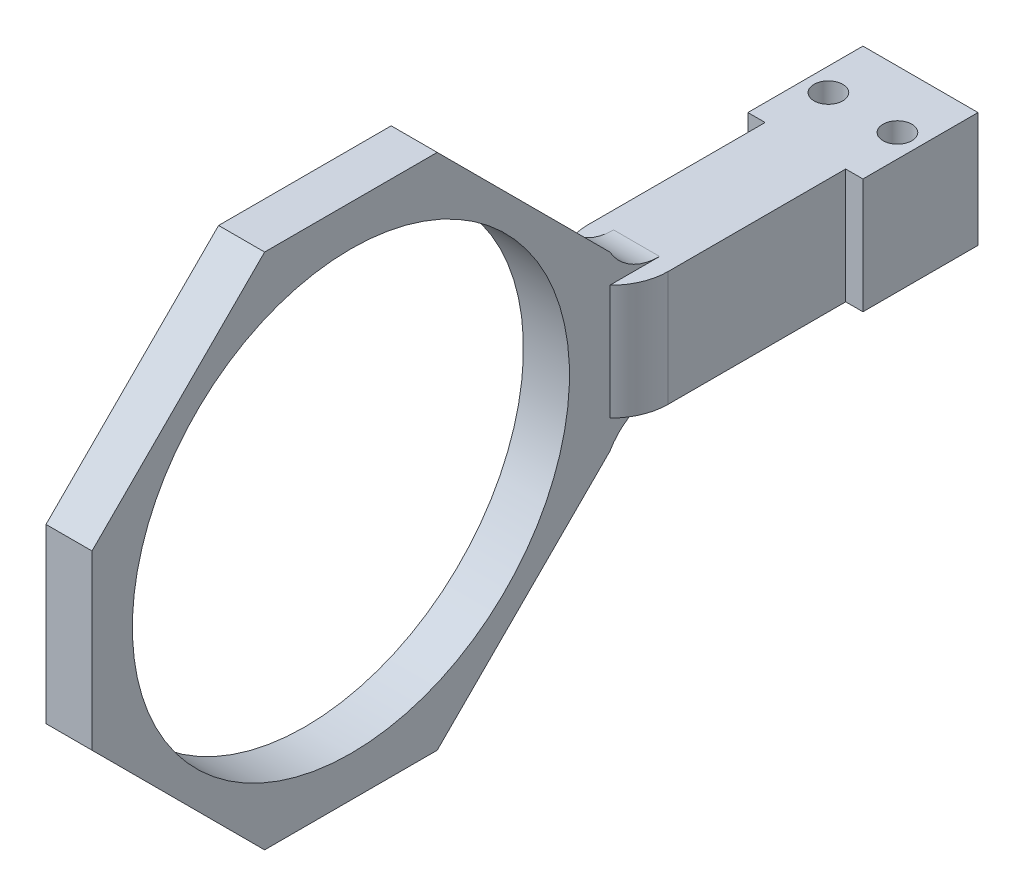
ISO-10303-21;
HEADER;
FILE_DESCRIPTION(('STEP AP214'),'2;1');
FILE_NAME('part.step','',(''),(''),'','','');
FILE_SCHEMA(('AUTOMOTIVE_DESIGN { 1 0 10303 214 1 1 1 1 }'));
ENDSEC;
DATA;
#1=APPLICATION_CONTEXT('core data for automotive mechanical design processes');
#2=APPLICATION_PROTOCOL_DEFINITION('international standard','automotive_design',2000,#1);
#3=PRODUCT_CONTEXT('',#1,'mechanical');
#4=PRODUCT('Part','Part','',(#3));
#5=PRODUCT_RELATED_PRODUCT_CATEGORY('part','',(#4));
#6=PRODUCT_DEFINITION_FORMATION('','',#4);
#7=PRODUCT_DEFINITION_CONTEXT('part definition',#1,'design');
#8=PRODUCT_DEFINITION('design','',#6,#7);
#9=PRODUCT_DEFINITION_SHAPE('','',#8);
#10=(LENGTH_UNIT() NAMED_UNIT(*) SI_UNIT(.MILLI.,.METRE.));
#11=(NAMED_UNIT(*) PLANE_ANGLE_UNIT() SI_UNIT($,.RADIAN.));
#12=(NAMED_UNIT(*) SI_UNIT($,.STERADIAN.) SOLID_ANGLE_UNIT());
#13=UNCERTAINTY_MEASURE_WITH_UNIT(LENGTH_MEASURE(1.E-05),#10,'distance_accuracy_value','');
#14=(GEOMETRIC_REPRESENTATION_CONTEXT(3) GLOBAL_UNCERTAINTY_ASSIGNED_CONTEXT((#13)) GLOBAL_UNIT_ASSIGNED_CONTEXT((#10,
#11,#12)) REPRESENTATION_CONTEXT('',''));
#15=CARTESIAN_POINT('',(0.,0.,0.));
#16=DIRECTION('',(0.,0.,1.));
#17=DIRECTION('',(1.,0.,0.));
#18=AXIS2_PLACEMENT_3D('',#15,#16,#17);
#19=CARTESIAN_POINT('',(0.,0.,20.));
#20=DIRECTION('',(0.,0.,1.));
#21=DIRECTION('',(1.,0.,0.));
#22=AXIS2_PLACEMENT_3D('',#19,#20,#21);
#23=PLANE('',#22);
#24=DIRECTION('',(0.,1.,0.));
#25=VECTOR('',#24,1.);
#26=CARTESIAN_POINT('',(7.,10.,20.));
#27=LINE('',#26,#25);
#28=CARTESIAN_POINT('',(7.,-10.,20.));
#29=VERTEX_POINT('',#28);
#30=CARTESIAN_POINT('',(7.,10.,20.));
#31=VERTEX_POINT('',#30);
#32=EDGE_CURVE('E237',#29,#31,#27,.T.);
#33=ORIENTED_EDGE('',*,*,#32,.F.);
#34=DIRECTION('',(1.,0.,0.));
#35=VECTOR('',#34,1.);
#36=CARTESIAN_POINT('',(-10.,-10.,20.));
#37=LINE('',#36,#35);
#38=CARTESIAN_POINT('',(10.,-10.,20.));
#39=VERTEX_POINT('',#38);
#40=EDGE_CURVE('E271',#29,#39,#37,.T.);
#41=ORIENTED_EDGE('',*,*,#40,.T.);
#42=DIRECTION('',(0.,1.,0.));
#43=VECTOR('',#42,1.);
#44=CARTESIAN_POINT('',(10.,10.,20.));
#45=LINE('',#44,#43);
#46=CARTESIAN_POINT('',(10.,10.,20.));
#47=VERTEX_POINT('',#46);
#48=EDGE_CURVE('E258',#39,#47,#45,.T.);
#49=ORIENTED_EDGE('',*,*,#48,.T.);
#50=DIRECTION('',(-1.,0.,0.));
#51=VECTOR('',#50,1.);
#52=CARTESIAN_POINT('',(-10.,10.,20.));
#53=LINE('',#52,#51);
#54=EDGE_CURVE('E264',#47,#31,#53,.T.);
#55=ORIENTED_EDGE('',*,*,#54,.T.);
#56=EDGE_LOOP('',(#33,#41,#49,#55));
#57=FACE_BOUND('',#56,.T.);
#58=ADVANCED_FACE('F47',(#57),#23,.T.);
#59=CARTESIAN_POINT('',(10.,10.,20.));
#60=DIRECTION('',(-1.,0.,0.));
#61=DIRECTION('',(0.,-1.,0.));
#62=AXIS2_PLACEMENT_3D('',#59,#60,#61);
#63=PLANE('',#62);
#64=DIRECTION('',(0.,1.,0.));
#65=VECTOR('',#64,1.);
#66=CARTESIAN_POINT('',(10.,10.,0.));
#67=LINE('',#66,#65);
#68=CARTESIAN_POINT('',(10.,-10.,0.));
#69=VERTEX_POINT('',#68);
#70=CARTESIAN_POINT('',(10.,10.,0.));
#71=VERTEX_POINT('',#70);
#72=EDGE_CURVE('E257',#69,#71,#67,.T.);
#73=ORIENTED_EDGE('',*,*,#72,.T.);
#74=DIRECTION('',(0.,0.,-1.));
#75=VECTOR('',#74,1.);
#76=CARTESIAN_POINT('',(10.,10.,20.));
#77=LINE('',#76,#75);
#78=EDGE_CURVE('E210',#47,#71,#77,.T.);
#79=ORIENTED_EDGE('',*,*,#78,.F.);
#80=ORIENTED_EDGE('',*,*,#48,.F.);
#81=DIRECTION('',(0.,0.,-1.));
#82=VECTOR('',#81,1.);
#83=CARTESIAN_POINT('',(10.,-10.,20.));
#84=LINE('',#83,#82);
#85=EDGE_CURVE('E276',#39,#69,#84,.T.);
#86=ORIENTED_EDGE('',*,*,#85,.T.);
#87=EDGE_LOOP('',(#73,#79,#80,#86));
#88=FACE_BOUND('',#87,.T.);
#89=ADVANCED_FACE('F455',(#88),#63,.F.);
#90=CARTESIAN_POINT('',(-10.,10.,20.));
#91=DIRECTION('',(0.,-1.,0.));
#92=DIRECTION('',(0.,0.,-1.));
#93=AXIS2_PLACEMENT_3D('',#90,#91,#92);
#94=PLANE('',#93);
#95=CARTESIAN_POINT('',(-6.00000000000001,10.,10.));
#96=DIRECTION('',(0.,1.,0.));
#97=DIRECTION('',(0.,0.,1.));
#98=AXIS2_PLACEMENT_3D('',#95,#96,#97);
#99=CIRCLE('',#98,2.5);
#100=CARTESIAN_POINT('',(-6.00000000000001,9.99999999999999,12.5));
#101=VERTEX_POINT('',#100);
#102=EDGE_CURVE('E391',#101,#101,#99,.T.);
#103=ORIENTED_EDGE('',*,*,#102,.F.);
#104=EDGE_LOOP('',(#103));
#105=FACE_BOUND('',#104,.T.);
#106=CARTESIAN_POINT('',(5.99999999999999,10.,10.));
#107=DIRECTION('',(0.,1.,0.));
#108=DIRECTION('',(0.,0.,1.));
#109=AXIS2_PLACEMENT_3D('',#106,#107,#108);
#110=CIRCLE('',#109,2.5);
#111=CARTESIAN_POINT('',(5.99999999999999,9.99999999999999,12.5));
#112=VERTEX_POINT('',#111);
#113=EDGE_CURVE('E399',#112,#112,#110,.T.);
#114=ORIENTED_EDGE('',*,*,#113,.F.);
#115=EDGE_LOOP('',(#114));
#116=FACE_BOUND('',#115,.T.);
#117=DIRECTION('',(0.,0.,1.));
#118=VECTOR('',#117,1.);
#119=CARTESIAN_POINT('',(4.,10.,148.));
#120=LINE('',#119,#118);
#121=CARTESIAN_POINT('',(4.,10.,49.3397459621557));
#122=VERTEX_POINT('',#121);
#123=CARTESIAN_POINT('',(4.,10.,58.));
#124=VERTEX_POINT('',#123);
#125=EDGE_CURVE('E197',#122,#124,#120,.T.);
#126=ORIENTED_EDGE('',*,*,#125,.T.);
#127=CARTESIAN_POINT('',(-3.,10.,50.8585715714571));
#128=DIRECTION('',(0.,-1.,0.));
#129=DIRECTION('',(0.,0.,-1.));
#130=AXIS2_PLACEMENT_3D('',#127,#128,#129);
#131=CIRCLE('',#130,10.);
#132=CARTESIAN_POINT('',(7.,10.,50.8585715714571));
#133=VERTEX_POINT('',#132);
#134=EDGE_CURVE('E188',#124,#133,#131,.F.);
#135=ORIENTED_EDGE('',*,*,#134,.T.);
#136=DIRECTION('',(0.,0.,-1.));
#137=VECTOR('',#136,1.);
#138=CARTESIAN_POINT('',(7.,10.,58.));
#139=LINE('',#138,#137);
#140=EDGE_CURVE('E254',#133,#31,#139,.T.);
#141=ORIENTED_EDGE('',*,*,#140,.T.);
#142=ORIENTED_EDGE('',*,*,#54,.F.);
#143=ORIENTED_EDGE('',*,*,#78,.T.);
#144=DIRECTION('',(-1.,0.,0.));
#145=VECTOR('',#144,1.);
#146=CARTESIAN_POINT('',(-10.,10.,0.));
#147=LINE('',#146,#145);
#148=CARTESIAN_POINT('',(-10.,10.,0.));
#149=VERTEX_POINT('',#148);
#150=EDGE_CURVE('E280',#71,#149,#147,.T.);
#151=ORIENTED_EDGE('',*,*,#150,.T.);
#152=DIRECTION('',(0.,0.,-1.));
#153=VECTOR('',#152,1.);
#154=CARTESIAN_POINT('',(-10.,10.,20.));
#155=LINE('',#154,#153);
#156=CARTESIAN_POINT('',(-10.,10.,20.));
#157=VERTEX_POINT('',#156);
#158=EDGE_CURVE('E217',#157,#149,#155,.T.);
#159=ORIENTED_EDGE('',*,*,#158,.F.);
#160=CARTESIAN_POINT('',(-7.,10.,20.));
#161=VERTEX_POINT('',#160);
#162=EDGE_CURVE('E262',#161,#157,#53,.T.);
#163=ORIENTED_EDGE('',*,*,#162,.F.);
#164=DIRECTION('',(0.,0.,-1.));
#165=VECTOR('',#164,1.);
#166=CARTESIAN_POINT('',(-7.,10.,58.));
#167=LINE('',#166,#165);
#168=CARTESIAN_POINT('',(-7.,10.,50.8585715714571));
#169=VERTEX_POINT('',#168);
#170=EDGE_CURVE('E251',#169,#161,#167,.T.);
#171=ORIENTED_EDGE('',*,*,#170,.F.);
#172=CARTESIAN_POINT('',(3.,10.,50.8585715714571));
#173=DIRECTION('',(0.,-1.,0.));
#174=DIRECTION('',(0.,0.,-1.));
#175=AXIS2_PLACEMENT_3D('',#172,#173,#174);
#176=CIRCLE('',#175,10.);
#177=CARTESIAN_POINT('',(-4.,10.,58.));
#178=VERTEX_POINT('',#177);
#179=EDGE_CURVE('E369',#169,#178,#176,.F.);
#180=ORIENTED_EDGE('',*,*,#179,.T.);
#181=DIRECTION('',(0.,0.,-1.));
#182=VECTOR('',#181,1.);
#183=CARTESIAN_POINT('',(-4.,10.,148.));
#184=LINE('',#183,#182);
#185=CARTESIAN_POINT('',(-4.,10.,49.3397459621557));
#186=VERTEX_POINT('',#185);
#187=EDGE_CURVE('E65',#178,#186,#184,.T.);
#188=ORIENTED_EDGE('',*,*,#187,.T.);
#189=DIRECTION('',(1.,0.,0.));
#190=VECTOR('',#189,1.);
#191=CARTESIAN_POINT('',(-10.,10.,49.3397459621557));
#192=LINE('',#191,#190);
#193=EDGE_CURVE('E202',#186,#122,#192,.T.);
#194=ORIENTED_EDGE('',*,*,#193,.T.);
#195=EDGE_LOOP('',(#126,#135,#141,#142,#143,#151,#159,#163,#171,#180,#188,#194));
#196=FACE_BOUND('',#195,.T.);
#197=ADVANCED_FACE('F200',(#105,#116,#196),#94,.F.);
#198=CARTESIAN_POINT('',(-10.,10.,20.));
#199=DIRECTION('',(1.,0.,0.));
#200=DIRECTION('',(0.,1.,0.));
#201=AXIS2_PLACEMENT_3D('',#198,#199,#200);
#202=PLANE('',#201);
#203=DIRECTION('',(0.,-1.,0.));
#204=VECTOR('',#203,1.);
#205=CARTESIAN_POINT('',(-10.,10.,0.));
#206=LINE('',#205,#204);
#207=CARTESIAN_POINT('',(-10.,-10.,0.));
#208=VERTEX_POINT('',#207);
#209=EDGE_CURVE('E283',#149,#208,#206,.T.);
#210=ORIENTED_EDGE('',*,*,#209,.T.);
#211=DIRECTION('',(0.,0.,-1.));
#212=VECTOR('',#211,1.);
#213=CARTESIAN_POINT('',(-10.,-10.,20.));
#214=LINE('',#213,#212);
#215=CARTESIAN_POINT('',(-10.,-10.,20.));
#216=VERTEX_POINT('',#215);
#217=EDGE_CURVE('E291',#216,#208,#214,.T.);
#218=ORIENTED_EDGE('',*,*,#217,.F.);
#219=DIRECTION('',(0.,-1.,0.));
#220=VECTOR('',#219,1.);
#221=CARTESIAN_POINT('',(-10.,10.,20.));
#222=LINE('',#221,#220);
#223=EDGE_CURVE('E268',#157,#216,#222,.T.);
#224=ORIENTED_EDGE('',*,*,#223,.F.);
#225=ORIENTED_EDGE('',*,*,#158,.T.);
#226=EDGE_LOOP('',(#210,#218,#224,#225));
#227=FACE_BOUND('',#226,.T.);
#228=ADVANCED_FACE('F477',(#227),#202,.F.);
#229=CARTESIAN_POINT('',(-10.,-10.,20.));
#230=DIRECTION('',(0.,1.,0.));
#231=DIRECTION('',(0.,0.,1.));
#232=AXIS2_PLACEMENT_3D('',#229,#230,#231);
#233=PLANE('',#232);
#234=CARTESIAN_POINT('',(-6.00000000000001,-9.99999999999999,10.));
#235=DIRECTION('',(0.,1.,0.));
#236=DIRECTION('',(0.,0.,1.));
#237=AXIS2_PLACEMENT_3D('',#234,#235,#236);
#238=CIRCLE('',#237,2.5);
#239=CARTESIAN_POINT('',(-6.00000000000001,-9.99999999999999,12.5));
#240=VERTEX_POINT('',#239);
#241=EDGE_CURVE('E51',#240,#240,#238,.T.);
#242=ORIENTED_EDGE('',*,*,#241,.T.);
#243=EDGE_LOOP('',(#242));
#244=FACE_BOUND('',#243,.T.);
#245=CARTESIAN_POINT('',(5.99999999999999,-9.99999999999999,10.));
#246=DIRECTION('',(0.,1.,0.));
#247=DIRECTION('',(0.,0.,1.));
#248=AXIS2_PLACEMENT_3D('',#245,#246,#247);
#249=CIRCLE('',#248,2.5);
#250=CARTESIAN_POINT('',(5.99999999999999,-9.99999999999999,12.5));
#251=VERTEX_POINT('',#250);
#252=EDGE_CURVE('E388',#251,#251,#249,.T.);
#253=ORIENTED_EDGE('',*,*,#252,.T.);
#254=EDGE_LOOP('',(#253));
#255=FACE_BOUND('',#254,.T.);
#256=DIRECTION('',(0.,0.,-1.));
#257=VECTOR('',#256,1.);
#258=CARTESIAN_POINT('',(7.,-10.,58.));
#259=LINE('',#258,#257);
#260=CARTESIAN_POINT('',(7.,-10.,50.8585715714571));
#261=VERTEX_POINT('',#260);
#262=EDGE_CURVE('E245',#261,#29,#259,.T.);
#263=ORIENTED_EDGE('',*,*,#262,.F.);
#264=CARTESIAN_POINT('',(-3.,-10.,50.8585715714571));
#265=DIRECTION('',(0.,1.,0.));
#266=DIRECTION('',(0.,0.,1.));
#267=AXIS2_PLACEMENT_3D('',#264,#265,#266);
#268=CIRCLE('',#267,10.);
#269=CARTESIAN_POINT('',(4.,-10.,58.));
#270=VERTEX_POINT('',#269);
#271=EDGE_CURVE('E366',#261,#270,#268,.F.);
#272=ORIENTED_EDGE('',*,*,#271,.T.);
#273=DIRECTION('',(0.,0.,-1.));
#274=VECTOR('',#273,1.);
#275=CARTESIAN_POINT('',(4.,-10.,148.));
#276=LINE('',#275,#274);
#277=CARTESIAN_POINT('',(4.,-10.,49.3397459621557));
#278=VERTEX_POINT('',#277);
#279=EDGE_CURVE('E73',#270,#278,#276,.T.);
#280=ORIENTED_EDGE('',*,*,#279,.T.);
#281=DIRECTION('',(-1.,0.,0.));
#282=VECTOR('',#281,1.);
#283=CARTESIAN_POINT('',(-10.,-10.,49.3397459621557));
#284=LINE('',#283,#282);
#285=CARTESIAN_POINT('',(-4.,-10.,49.3397459621557));
#286=VERTEX_POINT('',#285);
#287=EDGE_CURVE('E360',#278,#286,#284,.T.);
#288=ORIENTED_EDGE('',*,*,#287,.T.);
#289=DIRECTION('',(0.,0.,1.));
#290=VECTOR('',#289,1.);
#291=CARTESIAN_POINT('',(-4.,-10.,148.));
#292=LINE('',#291,#290);
#293=CARTESIAN_POINT('',(-4.,-10.,58.));
#294=VERTEX_POINT('',#293);
#295=EDGE_CURVE('E356',#286,#294,#292,.T.);
#296=ORIENTED_EDGE('',*,*,#295,.T.);
#297=CARTESIAN_POINT('',(3.,-10.,50.8585715714571));
#298=DIRECTION('',(0.,1.,0.));
#299=DIRECTION('',(0.,0.,1.));
#300=AXIS2_PLACEMENT_3D('',#297,#298,#299);
#301=CIRCLE('',#300,10.);
#302=CARTESIAN_POINT('',(-7.,-10.,50.8585715714571));
#303=VERTEX_POINT('',#302);
#304=EDGE_CURVE('E353',#294,#303,#301,.F.);
#305=ORIENTED_EDGE('',*,*,#304,.T.);
#306=DIRECTION('',(0.,0.,-1.));
#307=VECTOR('',#306,1.);
#308=CARTESIAN_POINT('',(-7.,-10.,58.));
#309=LINE('',#308,#307);
#310=CARTESIAN_POINT('',(-7.,-10.,20.));
#311=VERTEX_POINT('',#310);
#312=EDGE_CURVE('E248',#303,#311,#309,.T.);
#313=ORIENTED_EDGE('',*,*,#312,.T.);
#314=EDGE_CURVE('E272',#216,#311,#37,.T.);
#315=ORIENTED_EDGE('',*,*,#314,.F.);
#316=ORIENTED_EDGE('',*,*,#217,.T.);
#317=DIRECTION('',(1.,0.,0.));
#318=VECTOR('',#317,1.);
#319=CARTESIAN_POINT('',(-10.,-10.,0.));
#320=LINE('',#319,#318);
#321=EDGE_CURVE('E263',#208,#69,#320,.T.);
#322=ORIENTED_EDGE('',*,*,#321,.T.);
#323=ORIENTED_EDGE('',*,*,#85,.F.);
#324=ORIENTED_EDGE('',*,*,#40,.F.);
#325=EDGE_LOOP('',(#263,#272,#280,#288,#296,#305,#313,#315,#316,#322,#323,#324));
#326=FACE_BOUND('',#325,.T.);
#327=ADVANCED_FACE('F469',(#244,#255,#326),#233,.F.);
#328=DIRECTION('',(0.,-1.,0.));
#329=VECTOR('',#328,1.);
#330=CARTESIAN_POINT('',(-7.,10.,20.));
#331=LINE('',#330,#329);
#332=EDGE_CURVE('E241',#161,#311,#331,.T.);
#333=ORIENTED_EDGE('',*,*,#332,.F.);
#334=ORIENTED_EDGE('',*,*,#162,.T.);
#335=ORIENTED_EDGE('',*,*,#223,.T.);
#336=ORIENTED_EDGE('',*,*,#314,.T.);
#337=EDGE_LOOP('',(#333,#334,#335,#336));
#338=FACE_BOUND('',#337,.T.);
#339=ADVANCED_FACE('F458',(#338),#23,.T.);
#340=CARTESIAN_POINT('',(0.,0.,0.));
#341=DIRECTION('',(0.,0.,1.));
#342=DIRECTION('',(1.,0.,0.));
#343=AXIS2_PLACEMENT_3D('',#340,#341,#342);
#344=PLANE('',#343);
#345=ORIENTED_EDGE('',*,*,#72,.F.);
#346=ORIENTED_EDGE('',*,*,#321,.F.);
#347=ORIENTED_EDGE('',*,*,#209,.F.);
#348=ORIENTED_EDGE('',*,*,#150,.F.);
#349=EDGE_LOOP('',(#345,#346,#347,#348));
#350=FACE_BOUND('',#349,.T.);
#351=ADVANCED_FACE('F468',(#350),#344,.F.);
#352=CARTESIAN_POINT('',(7.,10.,58.));
#353=DIRECTION('',(-1.,0.,0.));
#354=DIRECTION('',(0.,0.,1.));
#355=AXIS2_PLACEMENT_3D('',#352,#353,#354);
#356=PLANE('',#355);
#357=ORIENTED_EDGE('',*,*,#140,.F.);
#358=DIRECTION('',(0.,-1.,0.));
#359=VECTOR('',#358,1.);
#360=CARTESIAN_POINT('',(7.,10.,50.8585715714571));
#361=LINE('',#360,#359);
#362=EDGE_CURVE('E193',#133,#261,#361,.T.);
#363=ORIENTED_EDGE('',*,*,#362,.T.);
#364=ORIENTED_EDGE('',*,*,#262,.T.);
#365=ORIENTED_EDGE('',*,*,#32,.T.);
#366=EDGE_LOOP('',(#357,#363,#364,#365));
#367=FACE_BOUND('',#366,.T.);
#368=ADVANCED_FACE('F475',(#367),#356,.F.);
#369=CARTESIAN_POINT('',(-7.,10.,58.));
#370=DIRECTION('',(1.,0.,0.));
#371=DIRECTION('',(0.,0.,-1.));
#372=AXIS2_PLACEMENT_3D('',#369,#370,#371);
#373=PLANE('',#372);
#374=ORIENTED_EDGE('',*,*,#312,.F.);
#375=DIRECTION('',(0.,1.,0.));
#376=VECTOR('',#375,1.);
#377=CARTESIAN_POINT('',(-7.,10.,50.8585715714571));
#378=LINE('',#377,#376);
#379=EDGE_CURVE('E378',#303,#169,#378,.T.);
#380=ORIENTED_EDGE('',*,*,#379,.T.);
#381=ORIENTED_EDGE('',*,*,#170,.T.);
#382=ORIENTED_EDGE('',*,*,#332,.T.);
#383=EDGE_LOOP('',(#374,#380,#381,#382));
#384=FACE_BOUND('',#383,.T.);
#385=ADVANCED_FACE('F549',(#384),#373,.F.);
#386=CARTESIAN_POINT('',(-4.,45.,148.));
#387=DIRECTION('',(1.,0.,0.));
#388=DIRECTION('',(0.,1.,0.));
#389=AXIS2_PLACEMENT_3D('',#386,#387,#388);
#390=PLANE('',#389);
#391=CARTESIAN_POINT('',(-4.00000000000002,0.,103.));
#392=DIRECTION('',(1.,0.,0.));
#393=DIRECTION('',(0.,1.,0.));
#394=AXIS2_PLACEMENT_3D('',#391,#392,#393);
#395=CIRCLE('',#394,37.9894185322996);
#396=CARTESIAN_POINT('',(-4.00000000000002,37.9894185322997,103.));
#397=VERTEX_POINT('',#396);
#398=EDGE_CURVE('E410',#397,#397,#395,.T.);
#399=ORIENTED_EDGE('',*,*,#398,.T.);
#400=EDGE_LOOP('',(#399));
#401=FACE_BOUND('',#400,.T.);
#402=DIRECTION('',(0.,-1.,0.));
#403=VECTOR('',#402,1.);
#404=CARTESIAN_POINT('',(-4.,45.,58.));
#405=LINE('',#404,#403);
#406=EDGE_CURVE('E209',#178,#294,#405,.T.);
#407=ORIENTED_EDGE('',*,*,#406,.T.);
#408=ORIENTED_EDGE('',*,*,#295,.F.);
#409=CARTESIAN_POINT('',(-4.,-20.,49.3397459621557));
#410=DIRECTION('',(1.,0.,0.));
#411=DIRECTION('',(0.,1.,0.));
#412=AXIS2_PLACEMENT_3D('',#409,#410,#411);
#413=CIRCLE('',#412,10.);
#414=CARTESIAN_POINT('',(-4.,-14.9999999999999,58.));
#415=VERTEX_POINT('',#414);
#416=EDGE_CURVE('E384',#286,#415,#413,.T.);
#417=ORIENTED_EDGE('',*,*,#416,.T.);
#418=DIRECTION('',(0.,-0.707106781186549,0.707106781186546));
#419=VECTOR('',#418,1.);
#420=CARTESIAN_POINT('',(-3.99999999999999,-45.,88.));
#421=LINE('',#420,#419);
#422=CARTESIAN_POINT('',(-3.99999999999999,-45.,88.));
#423=VERTEX_POINT('',#422);
#424=EDGE_CURVE('E331',#415,#423,#421,.T.);
#425=ORIENTED_EDGE('',*,*,#424,.T.);
#426=DIRECTION('',(0.,0.,-1.));
#427=VECTOR('',#426,1.);
#428=CARTESIAN_POINT('',(-3.99999999999999,-45.,148.));
#429=LINE('',#428,#427);
#430=CARTESIAN_POINT('',(-3.99999999999999,-45.,118.));
#431=VERTEX_POINT('',#430);
#432=EDGE_CURVE('E233',#431,#423,#429,.T.);
#433=ORIENTED_EDGE('',*,*,#432,.F.);
#434=DIRECTION('',(0.,-0.707106781186546,-0.707106781186549));
#435=VECTOR('',#434,1.);
#436=CARTESIAN_POINT('',(-4.,-15.,148.));
#437=LINE('',#436,#435);
#438=CARTESIAN_POINT('',(-4.,-15.,148.));
#439=VERTEX_POINT('',#438);
#440=EDGE_CURVE('E321',#431,#439,#437,.F.);
#441=ORIENTED_EDGE('',*,*,#440,.T.);
#442=DIRECTION('',(0.,-1.,0.));
#443=VECTOR('',#442,1.);
#444=CARTESIAN_POINT('',(-4.,45.,148.));
#445=LINE('',#444,#443);
#446=CARTESIAN_POINT('',(-4.,15.,148.));
#447=VERTEX_POINT('',#446);
#448=EDGE_CURVE('E414',#447,#439,#445,.T.);
#449=ORIENTED_EDGE('',*,*,#448,.F.);
#450=DIRECTION('',(0.,-0.707106781186546,0.707106781186549));
#451=VECTOR('',#450,1.);
#452=CARTESIAN_POINT('',(-4.,15.,148.));
#453=LINE('',#452,#451);
#454=CARTESIAN_POINT('',(-4.,45.,118.));
#455=VERTEX_POINT('',#454);
#456=EDGE_CURVE('E324',#447,#455,#453,.F.);
#457=ORIENTED_EDGE('',*,*,#456,.T.);
#458=DIRECTION('',(0.,0.,-1.));
#459=VECTOR('',#458,1.);
#460=CARTESIAN_POINT('',(-4.,45.,148.));
#461=LINE('',#460,#459);
#462=CARTESIAN_POINT('',(-4.,45.,88.));
#463=VERTEX_POINT('',#462);
#464=EDGE_CURVE('E221',#455,#463,#461,.T.);
#465=ORIENTED_EDGE('',*,*,#464,.T.);
#466=DIRECTION('',(0.,-0.707106781186549,-0.707106781186546));
#467=VECTOR('',#466,1.);
#468=CARTESIAN_POINT('',(-4.,45.,88.));
#469=LINE('',#468,#467);
#470=CARTESIAN_POINT('',(-4.,14.9999999999999,58.));
#471=VERTEX_POINT('',#470);
#472=EDGE_CURVE('E327',#463,#471,#469,.T.);
#473=ORIENTED_EDGE('',*,*,#472,.T.);
#474=CARTESIAN_POINT('',(-4.,20.,49.3397459621557));
#475=DIRECTION('',(1.,0.,0.));
#476=DIRECTION('',(0.,1.,0.));
#477=AXIS2_PLACEMENT_3D('',#474,#475,#476);
#478=CIRCLE('',#477,10.);
#479=EDGE_CURVE('E57',#471,#186,#478,.T.);
#480=ORIENTED_EDGE('',*,*,#479,.T.);
#481=ORIENTED_EDGE('',*,*,#187,.F.);
#482=EDGE_LOOP('',(#407,#408,#417,#425,#433,#441,#449,#457,#465,#473,#480,#481));
#483=FACE_BOUND('',#482,.T.);
#484=ADVANCED_FACE('F430',(#401,#483),#390,.F.);
#485=CARTESIAN_POINT('',(4.00000000000001,-45.,148.));
#486=DIRECTION('',(0.,1.,0.));
#487=DIRECTION('',(0.,0.,1.));
#488=AXIS2_PLACEMENT_3D('',#485,#486,#487);
#489=PLANE('',#488);
#490=ORIENTED_EDGE('',*,*,#432,.T.);
#491=DIRECTION('',(1.,0.,0.));
#492=VECTOR('',#491,1.);
#493=CARTESIAN_POINT('',(4.00000000000001,-45.,88.));
#494=LINE('',#493,#492);
#495=CARTESIAN_POINT('',(4.00000000000001,-45.,88.));
#496=VERTEX_POINT('',#495);
#497=EDGE_CURVE('E300',#423,#496,#494,.T.);
#498=ORIENTED_EDGE('',*,*,#497,.T.);
#499=DIRECTION('',(0.,0.,-1.));
#500=VECTOR('',#499,1.);
#501=CARTESIAN_POINT('',(4.00000000000001,-45.,148.));
#502=LINE('',#501,#500);
#503=CARTESIAN_POINT('',(4.00000000000001,-45.,118.));
#504=VERTEX_POINT('',#503);
#505=EDGE_CURVE('E230',#504,#496,#502,.T.);
#506=ORIENTED_EDGE('',*,*,#505,.F.);
#507=DIRECTION('',(-1.,0.,0.));
#508=VECTOR('',#507,1.);
#509=CARTESIAN_POINT('',(4.00000000000001,-45.,118.));
#510=LINE('',#509,#508);
#511=EDGE_CURVE('E214',#504,#431,#510,.T.);
#512=ORIENTED_EDGE('',*,*,#511,.T.);
#513=EDGE_LOOP('',(#490,#498,#506,#512));
#514=FACE_BOUND('',#513,.T.);
#515=ADVANCED_FACE('F508',(#514),#489,.F.);
#516=CARTESIAN_POINT('',(4.,45.,148.));
#517=DIRECTION('',(-1.,0.,0.));
#518=DIRECTION('',(0.,-1.,0.));
#519=AXIS2_PLACEMENT_3D('',#516,#517,#518);
#520=PLANE('',#519);
#521=CARTESIAN_POINT('',(4.,0.,103.));
#522=DIRECTION('',(1.,0.,0.));
#523=DIRECTION('',(0.,1.,0.));
#524=AXIS2_PLACEMENT_3D('',#521,#522,#523);
#525=CIRCLE('',#524,37.9894185322996);
#526=CARTESIAN_POINT('',(3.99999999999999,37.9894185322997,103.));
#527=VERTEX_POINT('',#526);
#528=EDGE_CURVE('E397',#527,#527,#525,.T.);
#529=ORIENTED_EDGE('',*,*,#528,.F.);
#530=EDGE_LOOP('',(#529));
#531=FACE_BOUND('',#530,.T.);
#532=ORIENTED_EDGE('',*,*,#505,.T.);
#533=DIRECTION('',(0.,0.707106781186549,-0.707106781186546));
#534=VECTOR('',#533,1.);
#535=CARTESIAN_POINT('',(4.00000000000001,-45.,88.));
#536=LINE('',#535,#534);
#537=CARTESIAN_POINT('',(4.,-14.9999999999999,58.));
#538=VERTEX_POINT('',#537);
#539=EDGE_CURVE('E313',#496,#538,#536,.T.);
#540=ORIENTED_EDGE('',*,*,#539,.T.);
#541=CARTESIAN_POINT('',(4.,-20.,49.3397459621557));
#542=DIRECTION('',(-1.,0.,0.));
#543=DIRECTION('',(0.,-1.,0.));
#544=AXIS2_PLACEMENT_3D('',#541,#542,#543);
#545=CIRCLE('',#544,10.);
#546=EDGE_CURVE('E381',#538,#278,#545,.T.);
#547=ORIENTED_EDGE('',*,*,#546,.T.);
#548=ORIENTED_EDGE('',*,*,#279,.F.);
#549=DIRECTION('',(0.,1.,0.));
#550=VECTOR('',#549,1.);
#551=CARTESIAN_POINT('',(4.,45.,58.));
#552=LINE('',#551,#550);
#553=EDGE_CURVE('E192',#270,#124,#552,.T.);
#554=ORIENTED_EDGE('',*,*,#553,.T.);
#555=ORIENTED_EDGE('',*,*,#125,.F.);
#556=CARTESIAN_POINT('',(4.,20.,49.3397459621557));
#557=DIRECTION('',(-1.,0.,0.));
#558=DIRECTION('',(0.,-1.,0.));
#559=AXIS2_PLACEMENT_3D('',#556,#557,#558);
#560=CIRCLE('',#559,10.);
#561=CARTESIAN_POINT('',(4.,14.9999999999999,58.));
#562=VERTEX_POINT('',#561);
#563=EDGE_CURVE('E11',#122,#562,#560,.T.);
#564=ORIENTED_EDGE('',*,*,#563,.T.);
#565=DIRECTION('',(0.,0.707106781186549,0.707106781186546));
#566=VECTOR('',#565,1.);
#567=CARTESIAN_POINT('',(4.,45.,88.));
#568=LINE('',#567,#566);
#569=CARTESIAN_POINT('',(4.,45.,88.));
#570=VERTEX_POINT('',#569);
#571=EDGE_CURVE('E310',#562,#570,#568,.T.);
#572=ORIENTED_EDGE('',*,*,#571,.T.);
#573=DIRECTION('',(0.,0.,-1.));
#574=VECTOR('',#573,1.);
#575=CARTESIAN_POINT('',(4.,45.,148.));
#576=LINE('',#575,#574);
#577=CARTESIAN_POINT('',(4.,45.,118.));
#578=VERTEX_POINT('',#577);
#579=EDGE_CURVE('E225',#578,#570,#576,.T.);
#580=ORIENTED_EDGE('',*,*,#579,.F.);
#581=DIRECTION('',(0.,0.707106781186546,-0.707106781186549));
#582=VECTOR('',#581,1.);
#583=CARTESIAN_POINT('',(4.,15.,148.));
#584=LINE('',#583,#582);
#585=CARTESIAN_POINT('',(4.,15.,148.));
#586=VERTEX_POINT('',#585);
#587=EDGE_CURVE('E307',#578,#586,#584,.F.);
#588=ORIENTED_EDGE('',*,*,#587,.T.);
#589=DIRECTION('',(0.,1.,0.));
#590=VECTOR('',#589,1.);
#591=CARTESIAN_POINT('',(4.,45.,148.));
#592=LINE('',#591,#590);
#593=CARTESIAN_POINT('',(4.,-15.,148.));
#594=VERTEX_POINT('',#593);
#595=EDGE_CURVE('E226',#594,#586,#592,.T.);
#596=ORIENTED_EDGE('',*,*,#595,.F.);
#597=DIRECTION('',(0.,0.707106781186546,0.707106781186549));
#598=VECTOR('',#597,1.);
#599=CARTESIAN_POINT('',(4.,-15.,148.));
#600=LINE('',#599,#598);
#601=EDGE_CURVE('E304',#594,#504,#600,.F.);
#602=ORIENTED_EDGE('',*,*,#601,.T.);
#603=EDGE_LOOP('',(#532,#540,#547,#548,#554,#555,#564,#572,#580,#588,#596,#602));
#604=FACE_BOUND('',#603,.T.);
#605=ADVANCED_FACE('F207',(#531,#604),#520,.F.);
#606=CARTESIAN_POINT('',(4.,45.,148.));
#607=DIRECTION('',(0.,-1.,0.));
#608=DIRECTION('',(0.,0.,-1.));
#609=AXIS2_PLACEMENT_3D('',#606,#607,#608);
#610=PLANE('',#609);
#611=ORIENTED_EDGE('',*,*,#579,.T.);
#612=DIRECTION('',(-1.,0.,0.));
#613=VECTOR('',#612,1.);
#614=CARTESIAN_POINT('',(-4.,45.,88.));
#615=LINE('',#614,#613);
#616=EDGE_CURVE('E337',#570,#463,#615,.T.);
#617=ORIENTED_EDGE('',*,*,#616,.T.);
#618=ORIENTED_EDGE('',*,*,#464,.F.);
#619=DIRECTION('',(1.,0.,0.));
#620=VECTOR('',#619,1.);
#621=CARTESIAN_POINT('',(4.,45.,118.));
#622=LINE('',#621,#620);
#623=EDGE_CURVE('E334',#455,#578,#622,.T.);
#624=ORIENTED_EDGE('',*,*,#623,.T.);
#625=EDGE_LOOP('',(#611,#617,#618,#624));
#626=FACE_BOUND('',#625,.T.);
#627=ADVANCED_FACE('F432',(#626),#610,.F.);
#628=CARTESIAN_POINT('',(0.,0.,148.));
#629=DIRECTION('',(0.,0.,-1.));
#630=DIRECTION('',(-1.,0.,0.));
#631=AXIS2_PLACEMENT_3D('',#628,#629,#630);
#632=PLANE('',#631);
#633=ORIENTED_EDGE('',*,*,#595,.T.);
#634=DIRECTION('',(-1.,0.,0.));
#635=VECTOR('',#634,1.);
#636=CARTESIAN_POINT('',(0.,15.,148.));
#637=LINE('',#636,#635);
#638=EDGE_CURVE('E349',#586,#447,#637,.T.);
#639=ORIENTED_EDGE('',*,*,#638,.T.);
#640=ORIENTED_EDGE('',*,*,#448,.T.);
#641=DIRECTION('',(1.,0.,0.));
#642=VECTOR('',#641,1.);
#643=CARTESIAN_POINT('',(0.,-15.,148.));
#644=LINE('',#643,#642);
#645=EDGE_CURVE('E345',#439,#594,#644,.T.);
#646=ORIENTED_EDGE('',*,*,#645,.T.);
#647=EDGE_LOOP('',(#633,#639,#640,#646));
#648=FACE_BOUND('',#647,.T.);
#649=ADVANCED_FACE('F422',(#648),#632,.F.);
#650=CARTESIAN_POINT('',(4.00000000000001,-45.,88.));
#651=DIRECTION('',(0.,-0.707106781186546,-0.707106781186549));
#652=DIRECTION('',(-1.,0.,0.));
#653=AXIS2_PLACEMENT_3D('',#650,#651,#652);
#654=PLANE('',#653);
#655=ORIENTED_EDGE('',*,*,#424,.F.);
#656=DIRECTION('',(-1.,0.,0.));
#657=VECTOR('',#656,1.);
#658=CARTESIAN_POINT('',(-3.99999999999999,-14.9999999999999,58.));
#659=LINE('',#658,#657);
#660=EDGE_CURVE('E317',#538,#415,#659,.T.);
#661=ORIENTED_EDGE('',*,*,#660,.F.);
#662=ORIENTED_EDGE('',*,*,#539,.F.);
#663=ORIENTED_EDGE('',*,*,#497,.F.);
#664=EDGE_LOOP('',(#655,#661,#662,#663));
#665=FACE_BOUND('',#664,.T.);
#666=ADVANCED_FACE('F505',(#665),#654,.T.);
#667=CARTESIAN_POINT('',(4.,45.,88.));
#668=DIRECTION('',(0.,0.707106781186546,-0.707106781186549));
#669=DIRECTION('',(1.,0.,0.));
#670=AXIS2_PLACEMENT_3D('',#667,#668,#669);
#671=PLANE('',#670);
#672=ORIENTED_EDGE('',*,*,#571,.F.);
#673=DIRECTION('',(1.,0.,0.));
#674=VECTOR('',#673,1.);
#675=CARTESIAN_POINT('',(4.,14.9999999999999,58.));
#676=LINE('',#675,#674);
#677=EDGE_CURVE('E341',#471,#562,#676,.T.);
#678=ORIENTED_EDGE('',*,*,#677,.F.);
#679=ORIENTED_EDGE('',*,*,#472,.F.);
#680=ORIENTED_EDGE('',*,*,#616,.F.);
#681=EDGE_LOOP('',(#672,#678,#679,#680));
#682=FACE_BOUND('',#681,.T.);
#683=ADVANCED_FACE('F437',(#682),#671,.T.);
#684=CARTESIAN_POINT('',(0.,15.,148.));
#685=DIRECTION('',(0.,-0.707106781186549,-0.707106781186546));
#686=DIRECTION('',(-1.,0.,0.));
#687=AXIS2_PLACEMENT_3D('',#684,#685,#686);
#688=PLANE('',#687);
#689=ORIENTED_EDGE('',*,*,#587,.F.);
#690=ORIENTED_EDGE('',*,*,#623,.F.);
#691=ORIENTED_EDGE('',*,*,#456,.F.);
#692=ORIENTED_EDGE('',*,*,#638,.F.);
#693=EDGE_LOOP('',(#689,#690,#691,#692));
#694=FACE_BOUND('',#693,.T.);
#695=ADVANCED_FACE('F427',(#694),#688,.F.);
#696=CARTESIAN_POINT('',(0.,-15.,148.));
#697=DIRECTION('',(0.,0.707106781186549,-0.707106781186546));
#698=DIRECTION('',(1.,0.,0.));
#699=AXIS2_PLACEMENT_3D('',#696,#697,#698);
#700=PLANE('',#699);
#701=ORIENTED_EDGE('',*,*,#440,.F.);
#702=ORIENTED_EDGE('',*,*,#511,.F.);
#703=ORIENTED_EDGE('',*,*,#601,.F.);
#704=ORIENTED_EDGE('',*,*,#645,.F.);
#705=EDGE_LOOP('',(#701,#702,#703,#704));
#706=FACE_BOUND('',#705,.T.);
#707=ADVANCED_FACE('F512',(#706),#700,.F.);
#708=CARTESIAN_POINT('',(-86.,0.,103.));
#709=DIRECTION('',(1.,0.,0.));
#710=DIRECTION('',(0.,1.,0.));
#711=AXIS2_PLACEMENT_3D('',#708,#709,#710);
#712=CYLINDRICAL_SURFACE('',#711,37.9894185322996);
#713=CARTESIAN_POINT('',(3.99999999999999,37.9894185322997,103.));
#714=CARTESIAN_POINT('',(3.91666666666666,37.9894185322997,103.));
#715=CARTESIAN_POINT('',(3.83333333333332,37.9894185322997,103.));
#716=CARTESIAN_POINT('',(3.66666666666666,37.9894185322997,103.));
#717=CARTESIAN_POINT('',(3.58333333333332,37.9894185322997,103.));
#718=CARTESIAN_POINT('',(3.41666666666666,37.9894185322997,103.));
#719=CARTESIAN_POINT('',(3.33333333333332,37.9894185322997,103.));
#720=CARTESIAN_POINT('',(3.16666666666666,37.9894185322997,103.));
#721=CARTESIAN_POINT('',(3.08333333333332,37.9894185322997,103.));
#722=CARTESIAN_POINT('',(2.91666666666666,37.9894185322997,103.));
#723=CARTESIAN_POINT('',(2.83333333333332,37.9894185322997,103.));
#724=CARTESIAN_POINT('',(2.66666666666666,37.9894185322997,103.));
#725=CARTESIAN_POINT('',(2.58333333333332,37.9894185322997,103.));
#726=CARTESIAN_POINT('',(2.41666666666665,37.9894185322997,103.));
#727=CARTESIAN_POINT('',(2.33333333333332,37.9894185322997,103.));
#728=CARTESIAN_POINT('',(2.16666666666665,37.9894185322997,103.));
#729=CARTESIAN_POINT('',(2.08333333333332,37.9894185322997,103.));
#730=CARTESIAN_POINT('',(1.91666666666665,37.9894185322997,103.));
#731=CARTESIAN_POINT('',(1.83333333333332,37.9894185322997,103.));
#732=CARTESIAN_POINT('',(1.66666666666665,37.9894185322997,103.));
#733=CARTESIAN_POINT('',(1.58333333333332,37.9894185322997,103.));
#734=CARTESIAN_POINT('',(1.41666666666665,37.9894185322997,103.));
#735=CARTESIAN_POINT('',(1.33333333333332,37.9894185322997,103.));
#736=CARTESIAN_POINT('',(1.16666666666665,37.9894185322997,103.));
#737=CARTESIAN_POINT('',(1.08333333333332,37.9894185322997,103.));
#738=CARTESIAN_POINT('',(0.916666666666654,37.9894185322997,103.));
#739=CARTESIAN_POINT('',(0.83333333333332,37.9894185322997,103.));
#740=CARTESIAN_POINT('',(0.666666666666653,37.9894185322997,103.));
#741=CARTESIAN_POINT('',(0.58333333333332,37.9894185322997,103.));
#742=CARTESIAN_POINT('',(0.416666666666653,37.9894185322997,103.));
#743=CARTESIAN_POINT('',(0.33333333333332,37.9894185322997,103.));
#744=CARTESIAN_POINT('',(0.166666666666653,37.9894185322997,103.));
#745=CARTESIAN_POINT('',(0.0833333333333195,37.9894185322997,103.));
#746=CARTESIAN_POINT('',(-0.0833333333333473,37.9894185322997,103.));
#747=CARTESIAN_POINT('',(-0.166666666666681,37.9894185322997,103.));
#748=CARTESIAN_POINT('',(-0.333333333333348,37.9894185322997,103.));
#749=CARTESIAN_POINT('',(-0.416666666666681,37.9894185322997,103.));
#750=CARTESIAN_POINT('',(-0.583333333333348,37.9894185322997,103.));
#751=CARTESIAN_POINT('',(-0.666666666666681,37.9894185322997,103.));
#752=CARTESIAN_POINT('',(-0.833333333333348,37.9894185322997,103.));
#753=CARTESIAN_POINT('',(-0.916666666666681,37.9894185322997,103.));
#754=CARTESIAN_POINT('',(-1.08333333333335,37.9894185322997,103.));
#755=CARTESIAN_POINT('',(-1.16666666666668,37.9894185322997,103.));
#756=CARTESIAN_POINT('',(-1.33333333333335,37.9894185322997,103.));
#757=CARTESIAN_POINT('',(-1.41666666666668,37.9894185322997,103.));
#758=CARTESIAN_POINT('',(-1.58333333333335,37.9894185322997,103.));
#759=CARTESIAN_POINT('',(-1.66666666666668,37.9894185322997,103.));
#760=CARTESIAN_POINT('',(-1.83333333333335,37.9894185322997,103.));
#761=CARTESIAN_POINT('',(-1.91666666666668,37.9894185322997,103.));
#762=CARTESIAN_POINT('',(-2.08333333333335,37.9894185322997,103.));
#763=CARTESIAN_POINT('',(-2.16666666666668,37.9894185322997,103.));
#764=CARTESIAN_POINT('',(-2.33333333333335,37.9894185322997,103.));
#765=CARTESIAN_POINT('',(-2.41666666666668,37.9894185322997,103.));
#766=CARTESIAN_POINT('',(-2.58333333333335,37.9894185322997,103.));
#767=CARTESIAN_POINT('',(-2.66666666666668,37.9894185322997,103.));
#768=CARTESIAN_POINT('',(-2.83333333333335,37.9894185322997,103.));
#769=CARTESIAN_POINT('',(-2.91666666666668,37.9894185322997,103.));
#770=CARTESIAN_POINT('',(-3.08333333333335,37.9894185322997,103.));
#771=CARTESIAN_POINT('',(-3.16666666666668,37.9894185322997,103.));
#772=CARTESIAN_POINT('',(-3.33333333333335,37.9894185322997,103.));
#773=CARTESIAN_POINT('',(-3.41666666666668,37.9894185322997,103.));
#774=CARTESIAN_POINT('',(-3.58333333333335,37.9894185322997,103.));
#775=CARTESIAN_POINT('',(-3.66666666666668,37.9894185322997,103.));
#776=CARTESIAN_POINT('',(-3.83333333333335,37.9894185322997,103.));
#777=CARTESIAN_POINT('',(-3.91666666666668,37.9894185322997,103.));
#778=CARTESIAN_POINT('',(-4.00000000000002,37.9894185322997,103.));
#779=B_SPLINE_CURVE_WITH_KNOTS('',3,(#713,#714,#715,#716,#717,#718,#719,#720,#721,#722,#723,
#724,#725,#726,#727,#728,#729,#730,#731,#732,#733,#734,#735,#736,#737,#738,#739,#740,#741,#742,
#743,#744,#745,#746,#747,#748,#749,#750,#751,#752,#753,#754,#755,#756,#757,#758,#759,#760,#761,
#762,#763,#764,#765,#766,#767,#768,#769,#770,#771,#772,#773,#774,#775,#776,#777,#778),
.UNSPECIFIED.,.F.,.F.,(4,2,2,2,2,2,2,2,2,2,2,2,2,2,2,2,2,2,2,2,2,2,2,2,2,2,2,2,2,2,2,2,4),(0.,
0.25,0.5,0.750000000000001,1.,1.25,1.5,1.75,2.,2.25,2.5,2.75,3.,3.25,3.5,3.75,4.,4.25,4.5,4.75,
5.,5.25,5.50000000000001,5.75000000000001,6.00000000000001,6.25000000000001,6.50000000000001,
6.75000000000001,7.00000000000001,7.25000000000001,7.50000000000001,7.75000000000001,
8.00000000000001),.UNSPECIFIED.);
#780=EDGE_CURVE('BSEAM451',#527,#397,#779,.T.);
#781=ORIENTED_EDGE('',*,*,#528,.T.);
#782=ORIENTED_EDGE('',*,*,#398,.F.);
#783=ORIENTED_EDGE('',*,*,#780,.T.);
#784=ORIENTED_EDGE('',*,*,#780,.F.);
#785=EDGE_LOOP('',(#781,#783,#782,#784));
#786=FACE_BOUND('',#785,.T.);
#787=ADVANCED_FACE('F451',(#786),#712,.F.);
#788=CARTESIAN_POINT('',(0.,-20.,49.3397459621557));
#789=DIRECTION('',(-1.,0.,0.));
#790=DIRECTION('',(0.,0.,1.));
#791=AXIS2_PLACEMENT_3D('',#788,#789,#790);
#792=CYLINDRICAL_SURFACE('',#791,10.);
#793=ORIENTED_EDGE('',*,*,#416,.F.);
#794=ORIENTED_EDGE('',*,*,#287,.F.);
#795=ORIENTED_EDGE('',*,*,#546,.F.);
#796=ORIENTED_EDGE('',*,*,#660,.T.);
#797=EDGE_LOOP('',(#793,#794,#795,#796));
#798=FACE_BOUND('',#797,.T.);
#799=ADVANCED_FACE('F445',(#798),#792,.F.);
#800=CARTESIAN_POINT('',(0.,20.,49.3397459621557));
#801=DIRECTION('',(1.,0.,0.));
#802=DIRECTION('',(0.,0.,-1.));
#803=AXIS2_PLACEMENT_3D('',#800,#801,#802);
#804=CYLINDRICAL_SURFACE('',#803,10.);
#805=ORIENTED_EDGE('',*,*,#563,.F.);
#806=ORIENTED_EDGE('',*,*,#193,.F.);
#807=ORIENTED_EDGE('',*,*,#479,.F.);
#808=ORIENTED_EDGE('',*,*,#677,.T.);
#809=EDGE_LOOP('',(#805,#806,#807,#808));
#810=FACE_BOUND('',#809,.T.);
#811=ADVANCED_FACE('F443',(#810),#804,.F.);
#812=CARTESIAN_POINT('',(-3.,0.,50.8585715714571));
#813=DIRECTION('',(0.,-1.,0.));
#814=DIRECTION('',(1.,0.,0.));
#815=AXIS2_PLACEMENT_3D('',#812,#813,#814);
#816=CYLINDRICAL_SURFACE('',#815,10.);
#817=ORIENTED_EDGE('',*,*,#271,.F.);
#818=ORIENTED_EDGE('',*,*,#362,.F.);
#819=ORIENTED_EDGE('',*,*,#134,.F.);
#820=ORIENTED_EDGE('',*,*,#553,.F.);
#821=EDGE_LOOP('',(#817,#818,#819,#820));
#822=FACE_BOUND('',#821,.T.);
#823=ADVANCED_FACE('F191',(#822),#816,.T.);
#824=CARTESIAN_POINT('',(3.,0.,50.8585715714571));
#825=DIRECTION('',(0.,1.,0.));
#826=DIRECTION('',(-1.,0.,0.));
#827=AXIS2_PLACEMENT_3D('',#824,#825,#826);
#828=CYLINDRICAL_SURFACE('',#827,10.);
#829=ORIENTED_EDGE('',*,*,#179,.F.);
#830=ORIENTED_EDGE('',*,*,#379,.F.);
#831=ORIENTED_EDGE('',*,*,#304,.F.);
#832=ORIENTED_EDGE('',*,*,#406,.F.);
#833=EDGE_LOOP('',(#829,#830,#831,#832));
#834=FACE_BOUND('',#833,.T.);
#835=ADVANCED_FACE('F49',(#834),#828,.T.);
#836=CARTESIAN_POINT('',(5.99999999999999,-80.,10.));
#837=DIRECTION('',(0.,1.,0.));
#838=DIRECTION('',(0.,0.,1.));
#839=AXIS2_PLACEMENT_3D('',#836,#837,#838);
#840=CYLINDRICAL_SURFACE('',#839,2.5);
#841=CARTESIAN_POINT('',(5.99999999999999,9.99999999999999,12.5));
#842=CARTESIAN_POINT('',(5.99999999999999,9.79166666666666,12.5));
#843=CARTESIAN_POINT('',(5.99999999999999,9.58333333333333,12.5));
#844=CARTESIAN_POINT('',(5.99999999999999,9.16666666666666,12.5));
#845=CARTESIAN_POINT('',(5.99999999999999,8.95833333333333,12.5));
#846=CARTESIAN_POINT('',(5.99999999999999,8.54166666666666,12.5));
#847=CARTESIAN_POINT('',(5.99999999999999,8.33333333333333,12.5));
#848=CARTESIAN_POINT('',(5.99999999999999,7.91666666666666,12.5));
#849=CARTESIAN_POINT('',(5.99999999999999,7.70833333333333,12.5));
#850=CARTESIAN_POINT('',(5.99999999999999,7.29166666666666,12.5));
#851=CARTESIAN_POINT('',(5.99999999999999,7.08333333333333,12.5));
#852=CARTESIAN_POINT('',(5.99999999999999,6.66666666666666,12.5));
#853=CARTESIAN_POINT('',(5.99999999999999,6.45833333333333,12.5));
#854=CARTESIAN_POINT('',(5.99999999999999,6.04166666666666,12.5));
#855=CARTESIAN_POINT('',(5.99999999999999,5.83333333333333,12.5));
#856=CARTESIAN_POINT('',(5.99999999999999,5.41666666666666,12.5));
#857=CARTESIAN_POINT('',(5.99999999999999,5.20833333333332,12.5));
#858=CARTESIAN_POINT('',(5.99999999999999,4.79166666666666,12.5));
#859=CARTESIAN_POINT('',(5.99999999999999,4.58333333333333,12.5));
#860=CARTESIAN_POINT('',(5.99999999999999,4.16666666666667,12.5));
#861=CARTESIAN_POINT('',(5.99999999999999,3.95833333333334,12.5));
#862=CARTESIAN_POINT('',(5.99999999999999,3.54166666666667,12.5));
#863=CARTESIAN_POINT('',(5.99999999999999,3.33333333333334,12.5));
#864=CARTESIAN_POINT('',(5.99999999999999,2.91666666666667,12.5));
#865=CARTESIAN_POINT('',(5.99999999999999,2.70833333333334,12.5));
#866=CARTESIAN_POINT('',(5.99999999999999,2.29166666666667,12.5));
#867=CARTESIAN_POINT('',(5.99999999999999,2.08333333333334,12.5));
#868=CARTESIAN_POINT('',(5.99999999999999,1.66666666666667,12.5));
#869=CARTESIAN_POINT('',(5.99999999999999,1.45833333333333,12.5));
#870=CARTESIAN_POINT('',(5.99999999999999,1.04166666666667,12.5));
#871=CARTESIAN_POINT('',(5.99999999999999,0.833333333333334,12.5));
#872=CARTESIAN_POINT('',(5.99999999999999,0.416666666666667,12.5));
#873=CARTESIAN_POINT('',(5.99999999999999,0.208333333333333,12.5));
#874=CARTESIAN_POINT('',(5.99999999999999,-0.208333333333333,12.5));
#875=CARTESIAN_POINT('',(5.99999999999999,-0.416666666666667,12.5));
#876=CARTESIAN_POINT('',(5.99999999999999,-0.833333333333334,12.5));
#877=CARTESIAN_POINT('',(5.99999999999999,-1.04166666666667,12.5));
#878=CARTESIAN_POINT('',(5.99999999999999,-1.45833333333333,12.5));
#879=CARTESIAN_POINT('',(5.99999999999999,-1.66666666666667,12.5));
#880=CARTESIAN_POINT('',(5.99999999999999,-2.08333333333334,12.5));
#881=CARTESIAN_POINT('',(5.99999999999999,-2.29166666666667,12.5));
#882=CARTESIAN_POINT('',(5.99999999999999,-2.70833333333334,12.5));
#883=CARTESIAN_POINT('',(5.99999999999999,-2.91666666666667,12.5));
#884=CARTESIAN_POINT('',(5.99999999999999,-3.33333333333334,12.5));
#885=CARTESIAN_POINT('',(5.99999999999999,-3.54166666666667,12.5));
#886=CARTESIAN_POINT('',(5.99999999999999,-3.95833333333334,12.5));
#887=CARTESIAN_POINT('',(5.99999999999999,-4.16666666666667,12.5));
#888=CARTESIAN_POINT('',(5.99999999999999,-4.58333333333333,12.5));
#889=CARTESIAN_POINT('',(5.99999999999999,-4.79166666666666,12.5));
#890=CARTESIAN_POINT('',(5.99999999999999,-5.20833333333333,12.5));
#891=CARTESIAN_POINT('',(5.99999999999999,-5.41666666666667,12.5));
#892=CARTESIAN_POINT('',(5.99999999999999,-5.83333333333333,12.5));
#893=CARTESIAN_POINT('',(5.99999999999999,-6.04166666666666,12.5));
#894=CARTESIAN_POINT('',(5.99999999999999,-6.45833333333333,12.5));
#895=CARTESIAN_POINT('',(5.99999999999999,-6.66666666666666,12.5));
#896=CARTESIAN_POINT('',(5.99999999999999,-7.08333333333333,12.5));
#897=CARTESIAN_POINT('',(5.99999999999999,-7.29166666666666,12.5));
#898=CARTESIAN_POINT('',(5.99999999999999,-7.70833333333333,12.5));
#899=CARTESIAN_POINT('',(5.99999999999999,-7.91666666666666,12.5));
#900=CARTESIAN_POINT('',(5.99999999999999,-8.33333333333333,12.5));
#901=CARTESIAN_POINT('',(5.99999999999999,-8.54166666666666,12.5));
#902=CARTESIAN_POINT('',(5.99999999999999,-8.95833333333333,12.5));
#903=CARTESIAN_POINT('',(5.99999999999999,-9.16666666666666,12.5));
#904=CARTESIAN_POINT('',(5.99999999999999,-9.58333333333333,12.5));
#905=CARTESIAN_POINT('',(5.99999999999999,-9.79166666666666,12.5));
#906=CARTESIAN_POINT('',(5.99999999999999,-9.99999999999999,12.5));
#907=B_SPLINE_CURVE_WITH_KNOTS('',3,(#841,#842,#843,#844,#845,#846,#847,#848,#849,#850,#851,
#852,#853,#854,#855,#856,#857,#858,#859,#860,#861,#862,#863,#864,#865,#866,#867,#868,#869,#870,
#871,#872,#873,#874,#875,#876,#877,#878,#879,#880,#881,#882,#883,#884,#885,#886,#887,#888,#889,
#890,#891,#892,#893,#894,#895,#896,#897,#898,#899,#900,#901,#902,#903,#904,#905,#906),
.UNSPECIFIED.,.F.,.F.,(4,2,2,2,2,2,2,2,2,2,2,2,2,2,2,2,2,2,2,2,2,2,2,2,2,2,2,2,2,2,2,2,4),(0.,
0.625000000000001,1.25,1.875,2.5,3.125,3.75,4.375,5.,5.62499999999999,6.24999999999999,
6.87499999999999,7.49999999999999,8.12499999999999,8.74999999999999,9.37499999999999,
9.99999999999999,10.625,11.25,11.875,12.5,13.125,13.75,14.375,15.,15.625,16.25,16.875,17.5,
18.125,18.75,19.375,20.),.UNSPECIFIED.);
#908=EDGE_CURVE('BSEAM552',#112,#251,#907,.T.);
#909=ORIENTED_EDGE('',*,*,#113,.T.);
#910=ORIENTED_EDGE('',*,*,#252,.F.);
#911=ORIENTED_EDGE('',*,*,#908,.T.);
#912=ORIENTED_EDGE('',*,*,#908,.F.);
#913=EDGE_LOOP('',(#909,#911,#910,#912));
#914=FACE_BOUND('',#913,.T.);
#915=ADVANCED_FACE('F552',(#914),#840,.F.);
#916=CARTESIAN_POINT('',(-6.00000000000001,-80.,10.));
#917=DIRECTION('',(0.,1.,0.));
#918=DIRECTION('',(0.,0.,1.));
#919=AXIS2_PLACEMENT_3D('',#916,#917,#918);
#920=CYLINDRICAL_SURFACE('',#919,2.5);
#921=CARTESIAN_POINT('',(-6.00000000000001,9.99999999999999,12.5));
#922=CARTESIAN_POINT('',(-6.00000000000001,9.79166666666666,12.5));
#923=CARTESIAN_POINT('',(-6.00000000000001,9.58333333333333,12.5));
#924=CARTESIAN_POINT('',(-6.00000000000001,9.16666666666666,12.5));
#925=CARTESIAN_POINT('',(-6.00000000000001,8.95833333333333,12.5));
#926=CARTESIAN_POINT('',(-6.00000000000001,8.54166666666666,12.5));
#927=CARTESIAN_POINT('',(-6.00000000000001,8.33333333333333,12.5));
#928=CARTESIAN_POINT('',(-6.00000000000001,7.91666666666666,12.5));
#929=CARTESIAN_POINT('',(-6.00000000000001,7.70833333333333,12.5));
#930=CARTESIAN_POINT('',(-6.00000000000001,7.29166666666666,12.5));
#931=CARTESIAN_POINT('',(-6.00000000000001,7.08333333333333,12.5));
#932=CARTESIAN_POINT('',(-6.00000000000001,6.66666666666666,12.5));
#933=CARTESIAN_POINT('',(-6.00000000000001,6.45833333333333,12.5));
#934=CARTESIAN_POINT('',(-6.00000000000001,6.04166666666666,12.5));
#935=CARTESIAN_POINT('',(-6.00000000000001,5.83333333333333,12.5));
#936=CARTESIAN_POINT('',(-6.00000000000001,5.41666666666666,12.5));
#937=CARTESIAN_POINT('',(-6.00000000000001,5.20833333333332,12.5));
#938=CARTESIAN_POINT('',(-6.00000000000001,4.79166666666666,12.5));
#939=CARTESIAN_POINT('',(-6.00000000000001,4.58333333333333,12.5));
#940=CARTESIAN_POINT('',(-6.00000000000001,4.16666666666667,12.5));
#941=CARTESIAN_POINT('',(-6.00000000000001,3.95833333333334,12.5));
#942=CARTESIAN_POINT('',(-6.00000000000001,3.54166666666667,12.5));
#943=CARTESIAN_POINT('',(-6.00000000000001,3.33333333333334,12.5));
#944=CARTESIAN_POINT('',(-6.00000000000001,2.91666666666667,12.5));
#945=CARTESIAN_POINT('',(-6.00000000000001,2.70833333333334,12.5));
#946=CARTESIAN_POINT('',(-6.00000000000001,2.29166666666667,12.5));
#947=CARTESIAN_POINT('',(-6.00000000000001,2.08333333333334,12.5));
#948=CARTESIAN_POINT('',(-6.00000000000001,1.66666666666667,12.5));
#949=CARTESIAN_POINT('',(-6.00000000000001,1.45833333333333,12.5));
#950=CARTESIAN_POINT('',(-6.00000000000001,1.04166666666667,12.5));
#951=CARTESIAN_POINT('',(-6.00000000000001,0.833333333333334,12.5));
#952=CARTESIAN_POINT('',(-6.00000000000001,0.416666666666667,12.5));
#953=CARTESIAN_POINT('',(-6.00000000000001,0.208333333333333,12.5));
#954=CARTESIAN_POINT('',(-6.00000000000001,-0.208333333333333,12.5));
#955=CARTESIAN_POINT('',(-6.00000000000001,-0.416666666666667,12.5));
#956=CARTESIAN_POINT('',(-6.00000000000001,-0.833333333333334,12.5));
#957=CARTESIAN_POINT('',(-6.00000000000001,-1.04166666666667,12.5));
#958=CARTESIAN_POINT('',(-6.00000000000001,-1.45833333333333,12.5));
#959=CARTESIAN_POINT('',(-6.00000000000001,-1.66666666666667,12.5));
#960=CARTESIAN_POINT('',(-6.00000000000001,-2.08333333333334,12.5));
#961=CARTESIAN_POINT('',(-6.00000000000001,-2.29166666666667,12.5));
#962=CARTESIAN_POINT('',(-6.00000000000001,-2.70833333333334,12.5));
#963=CARTESIAN_POINT('',(-6.00000000000001,-2.91666666666667,12.5));
#964=CARTESIAN_POINT('',(-6.00000000000001,-3.33333333333334,12.5));
#965=CARTESIAN_POINT('',(-6.00000000000001,-3.54166666666667,12.5));
#966=CARTESIAN_POINT('',(-6.00000000000001,-3.95833333333334,12.5));
#967=CARTESIAN_POINT('',(-6.00000000000001,-4.16666666666667,12.5));
#968=CARTESIAN_POINT('',(-6.00000000000001,-4.58333333333333,12.5));
#969=CARTESIAN_POINT('',(-6.00000000000001,-4.79166666666666,12.5));
#970=CARTESIAN_POINT('',(-6.00000000000001,-5.20833333333333,12.5));
#971=CARTESIAN_POINT('',(-6.00000000000001,-5.41666666666667,12.5));
#972=CARTESIAN_POINT('',(-6.00000000000001,-5.83333333333333,12.5));
#973=CARTESIAN_POINT('',(-6.00000000000001,-6.04166666666666,12.5));
#974=CARTESIAN_POINT('',(-6.00000000000001,-6.45833333333333,12.5));
#975=CARTESIAN_POINT('',(-6.00000000000001,-6.66666666666666,12.5));
#976=CARTESIAN_POINT('',(-6.00000000000001,-7.08333333333333,12.5));
#977=CARTESIAN_POINT('',(-6.00000000000001,-7.29166666666666,12.5));
#978=CARTESIAN_POINT('',(-6.00000000000001,-7.70833333333333,12.5));
#979=CARTESIAN_POINT('',(-6.00000000000001,-7.91666666666666,12.5));
#980=CARTESIAN_POINT('',(-6.00000000000001,-8.33333333333333,12.5));
#981=CARTESIAN_POINT('',(-6.00000000000001,-8.54166666666666,12.5));
#982=CARTESIAN_POINT('',(-6.00000000000001,-8.95833333333333,12.5));
#983=CARTESIAN_POINT('',(-6.00000000000001,-9.16666666666666,12.5));
#984=CARTESIAN_POINT('',(-6.00000000000001,-9.58333333333333,12.5));
#985=CARTESIAN_POINT('',(-6.00000000000001,-9.79166666666666,12.5));
#986=CARTESIAN_POINT('',(-6.00000000000001,-9.99999999999999,12.5));
#987=B_SPLINE_CURVE_WITH_KNOTS('',3,(#921,#922,#923,#924,#925,#926,#927,#928,#929,#930,#931,
#932,#933,#934,#935,#936,#937,#938,#939,#940,#941,#942,#943,#944,#945,#946,#947,#948,#949,#950,
#951,#952,#953,#954,#955,#956,#957,#958,#959,#960,#961,#962,#963,#964,#965,#966,#967,#968,#969,
#970,#971,#972,#973,#974,#975,#976,#977,#978,#979,#980,#981,#982,#983,#984,#985,#986),
.UNSPECIFIED.,.F.,.F.,(4,2,2,2,2,2,2,2,2,2,2,2,2,2,2,2,2,2,2,2,2,2,2,2,2,2,2,2,2,2,2,2,4),(0.,
0.625000000000001,1.25,1.875,2.5,3.125,3.75,4.375,5.,5.62499999999999,6.24999999999999,
6.87499999999999,7.49999999999999,8.12499999999999,8.74999999999999,9.37499999999999,
9.99999999999999,10.625,11.25,11.875,12.5,13.125,13.75,14.375,15.,15.625,16.25,16.875,17.5,
18.125,18.75,19.375,20.),.UNSPECIFIED.);
#988=EDGE_CURVE('BSEAM556',#101,#240,#987,.T.);
#989=ORIENTED_EDGE('',*,*,#102,.T.);
#990=ORIENTED_EDGE('',*,*,#241,.F.);
#991=ORIENTED_EDGE('',*,*,#988,.T.);
#992=ORIENTED_EDGE('',*,*,#988,.F.);
#993=EDGE_LOOP('',(#989,#991,#990,#992));
#994=FACE_BOUND('',#993,.T.);
#995=ADVANCED_FACE('F556',(#994),#920,.F.);
#996=CLOSED_SHELL('',(#58,#89,#197,#228,#327,#339,#351,#368,#385,#484,#515,#605,#627,#649,#666,
#683,#695,#707,#787,#799,#811,#823,#835,#915,#995));
#997=MANIFOLD_SOLID_BREP('B2',#996);
#998=ADVANCED_BREP_SHAPE_REPRESENTATION('',(#18,#997),#14);
#999=SHAPE_DEFINITION_REPRESENTATION(#9,#998);
ENDSEC;
END-ISO-10303-21;
